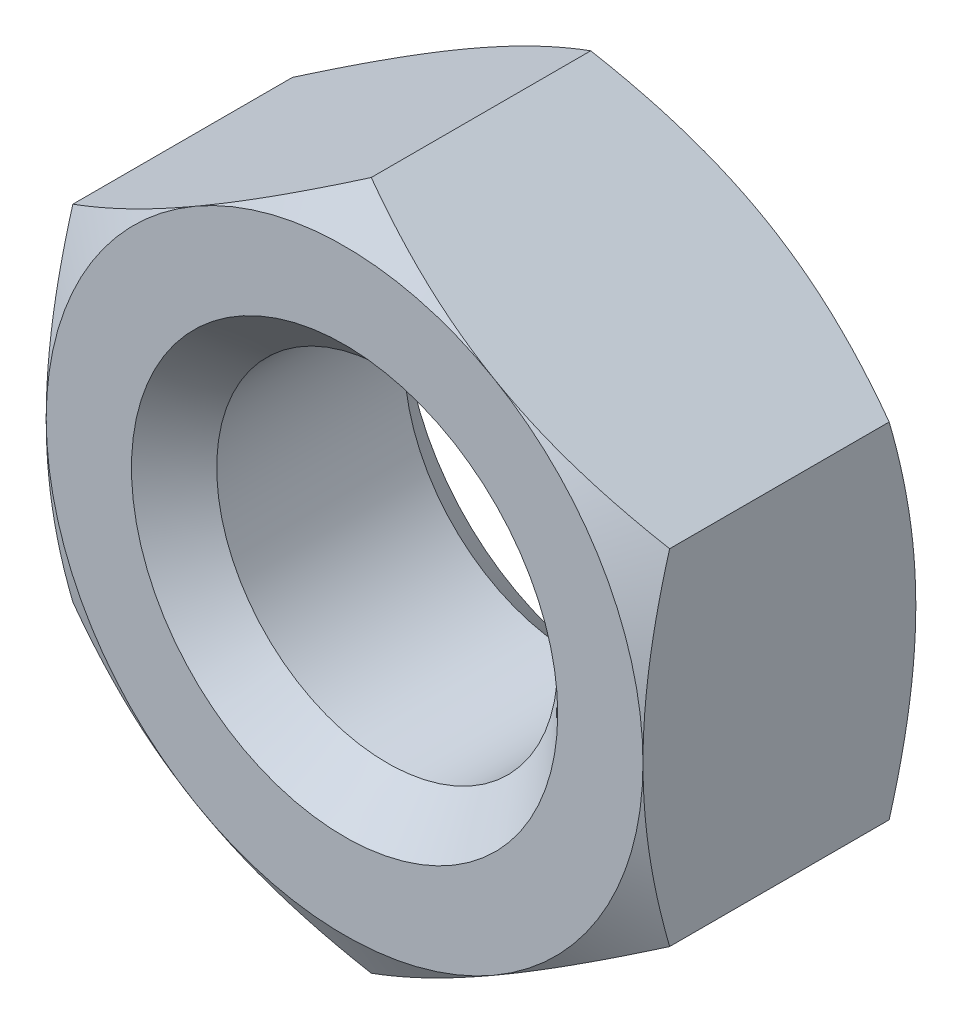
ISO-10303-21;
HEADER;
FILE_DESCRIPTION(('STEP AP214'),'2;1');
FILE_NAME('part.step','',(''),(''),'','','');
FILE_SCHEMA(('AUTOMOTIVE_DESIGN { 1 0 10303 214 1 1 1 1 }'));
ENDSEC;
DATA;
#1=APPLICATION_CONTEXT('core data for automotive mechanical design processes');
#2=APPLICATION_PROTOCOL_DEFINITION('international standard','automotive_design',2000,#1);
#3=PRODUCT_CONTEXT('',#1,'mechanical');
#4=PRODUCT('Part','Part','',(#3));
#5=PRODUCT_RELATED_PRODUCT_CATEGORY('part','',(#4));
#6=PRODUCT_DEFINITION_FORMATION('','',#4);
#7=PRODUCT_DEFINITION_CONTEXT('part definition',#1,'design');
#8=PRODUCT_DEFINITION('design','',#6,#7);
#9=PRODUCT_DEFINITION_SHAPE('','',#8);
#10=(LENGTH_UNIT() NAMED_UNIT(*) SI_UNIT(.MILLI.,.METRE.));
#11=(NAMED_UNIT(*) PLANE_ANGLE_UNIT() SI_UNIT($,.RADIAN.));
#12=(NAMED_UNIT(*) SI_UNIT($,.STERADIAN.) SOLID_ANGLE_UNIT());
#13=UNCERTAINTY_MEASURE_WITH_UNIT(LENGTH_MEASURE(1.E-05),#10,'distance_accuracy_value','');
#14=(GEOMETRIC_REPRESENTATION_CONTEXT(3) GLOBAL_UNCERTAINTY_ASSIGNED_CONTEXT((#13)) GLOBAL_UNIT_ASSIGNED_CONTEXT((#10,
#11,#12)) REPRESENTATION_CONTEXT('',''));
#15=CARTESIAN_POINT('',(0.,0.,0.));
#16=DIRECTION('',(0.,0.,1.));
#17=DIRECTION('',(1.,0.,0.));
#18=AXIS2_PLACEMENT_3D('',#15,#16,#17);
#19=CARTESIAN_POINT('',(3.5,2.02072594216369,1.6));
#20=DIRECTION('',(-0.5,-0.866025403784439,0.));
#21=DIRECTION('',(0.866025403784439,-0.5,0.));
#22=AXIS2_PLACEMENT_3D('',#19,#20,#21);
#23=PLANE('',#22);
#24=CARTESIAN_POINT('',(-0.000200000000000759,4.04156735438122,-1.28732593930663));
#25=CARTESIAN_POINT('',(0.153607178452449,3.9527667384984,-1.33861421101002));
#26=CARTESIAN_POINT('',(0.308742010834423,3.86319960126198,-1.38525904618381));
#27=CARTESIAN_POINT('',(0.62169800657678,3.68251437287562,-1.46667812446665));
#28=CARTESIAN_POINT('',(0.779524730787495,3.59139307116725,-1.50142356441544));
#29=CARTESIAN_POINT('',(1.09322221038013,3.41027974688034,-1.55550997281716));
#30=CARTESIAN_POINT('',(1.24904469916069,3.32031559103708,-1.57521091373962));
#31=CARTESIAN_POINT('',(1.56142288720537,3.13996396008052,-1.59872986726275));
#32=CARTESIAN_POINT('',(1.71797745103423,3.04957714051106,-1.60256735545444));
#33=CARTESIAN_POINT('',(2.01050921992099,2.88068384499777,-1.59458469812302));
#34=CARTESIAN_POINT('',(2.1465302124579,2.80215208834115,-1.58472456593039));
#35=CARTESIAN_POINT('',(2.41768602028899,2.64560020969754,-1.5534735331006));
#36=CARTESIAN_POINT('',(2.55281989768468,2.5675806292065,-1.5320719567142));
#37=CARTESIAN_POINT('',(2.82453479240518,2.41070596159679,-1.47856959211943));
#38=CARTESIAN_POINT('',(2.96108141927833,2.33187072981464,-1.44624200555492));
#39=CARTESIAN_POINT('',(3.2321380929445,2.17537608630783,-1.37287106619201));
#40=CARTESIAN_POINT('',(3.36665161246853,2.09771466960098,-1.33184495343014));
#41=CARTESIAN_POINT('',(3.5002,2.02061047210985,-1.28732593930663));
#42=B_SPLINE_CURVE_WITH_KNOTS('',3,(#24,#25,#26,#27,#28,#29,#30,#31,#32,#33,#34,#35,#36,#37,#38,
#39,#40,#41),.UNSPECIFIED.,.F.,.F.,(4,2,2,2,2,2,2,2,4),(0.,0.554793832886253,1.11092123814983,
1.65328467083218,2.19498204478403,2.6666513085086,3.13875761298267,3.62133612600509,
4.10296698719187),.UNSPECIFIED.);
#43=CARTESIAN_POINT('',(0.,4.04145188432738,-1.28739260883036));
#44=VERTEX_POINT('',#43);
#45=CARTESIAN_POINT('',(1.75,3.03108891324554,-1.6));
#46=VERTEX_POINT('',#45);
#47=EDGE_CURVE('E33',#44,#46,#42,.T.);
#48=ORIENTED_EDGE('',*,*,#47,.F.);
#49=DIRECTION('',(0.,0.,-1.));
#50=VECTOR('',#49,1.);
#51=CARTESIAN_POINT('',(0.,4.04145188432738,1.6));
#52=LINE('',#51,#50);
#53=CARTESIAN_POINT('',(0.,4.04145188432738,1.28739260883036));
#54=VERTEX_POINT('',#53);
#55=EDGE_CURVE('E149',#54,#44,#52,.T.);
#56=ORIENTED_EDGE('',*,*,#55,.F.);
#57=CARTESIAN_POINT('',(3.5002,2.02061047210985,1.28732593930663));
#58=CARTESIAN_POINT('',(3.34639282154755,2.10941108799267,1.33861421101002));
#59=CARTESIAN_POINT('',(3.19125798916558,2.19897822522909,1.38525904618381));
#60=CARTESIAN_POINT('',(2.87830199342322,2.37966345361545,1.46667812446665));
#61=CARTESIAN_POINT('',(2.7204752692125,2.47078475532382,1.50142356441544));
#62=CARTESIAN_POINT('',(2.40677778961987,2.65189807961073,1.55550997281717));
#63=CARTESIAN_POINT('',(2.25095530083931,2.74186223545399,1.57521091373962));
#64=CARTESIAN_POINT('',(1.93857711279463,2.92221386641055,1.59872986726275));
#65=CARTESIAN_POINT('',(1.78202254896577,3.01260068598001,1.60256735545444));
#66=CARTESIAN_POINT('',(1.48949078007901,3.1814939814933,1.59458469812302));
#67=CARTESIAN_POINT('',(1.35346978754209,3.26002573814993,1.58472456593039));
#68=CARTESIAN_POINT('',(1.08231397971101,3.41657761679354,1.5534735331006));
#69=CARTESIAN_POINT('',(0.947180102315318,3.49459719728457,1.5320719567142));
#70=CARTESIAN_POINT('',(0.675465207594817,3.65147186489429,1.47856959211943));
#71=CARTESIAN_POINT('',(0.538918580721665,3.73030709667644,1.44624200555492));
#72=CARTESIAN_POINT('',(0.267861907055498,3.88680174018324,1.37287106619201));
#73=CARTESIAN_POINT('',(0.133348387531463,3.96446315689009,1.33184495343014));
#74=CARTESIAN_POINT('',(-0.000200000000000305,4.04156735438122,1.28732593930663));
#75=B_SPLINE_CURVE_WITH_KNOTS('',3,(#57,#58,#59,#60,#61,#62,#63,#64,#65,#66,#67,#68,#69,#70,#71,
#72,#73,#74),.UNSPECIFIED.,.F.,.F.,(4,2,2,2,2,2,2,2,4),(0.,0.554793832886253,1.11092123814983,
1.65328467083218,2.19498204478403,2.6666513085086,3.13875761298267,3.62133612600509,
4.10296698719187),.UNSPECIFIED.);
#76=CARTESIAN_POINT('',(1.75,3.03108891324554,1.6));
#77=VERTEX_POINT('',#76);
#78=EDGE_CURVE('E211',#77,#54,#75,.T.);
#79=ORIENTED_EDGE('',*,*,#78,.F.);
#80=CARTESIAN_POINT('',(3.5,2.02072594216369,1.28739260883036));
#81=VERTEX_POINT('',#80);
#82=EDGE_CURVE('E138',#81,#77,#75,.T.);
#83=ORIENTED_EDGE('',*,*,#82,.F.);
#84=DIRECTION('',(0.,0.,-1.));
#85=VECTOR('',#84,1.);
#86=CARTESIAN_POINT('',(3.5,2.02072594216369,1.6));
#87=LINE('',#86,#85);
#88=CARTESIAN_POINT('',(3.5,2.02072594216369,-1.28739260883036));
#89=VERTEX_POINT('',#88);
#90=EDGE_CURVE('E134',#81,#89,#87,.T.);
#91=ORIENTED_EDGE('',*,*,#90,.T.);
#92=EDGE_CURVE('E128',#46,#89,#42,.T.);
#93=ORIENTED_EDGE('',*,*,#92,.F.);
#94=EDGE_LOOP('',(#48,#56,#79,#83,#91,#93));
#95=FACE_BOUND('',#94,.T.);
#96=ADVANCED_FACE('F16',(#95),#23,.F.);
#97=CARTESIAN_POINT('',(0.,4.04145188432738,1.6));
#98=DIRECTION('',(0.5,-0.866025403784438,0.));
#99=DIRECTION('',(0.866025403784439,0.5,0.));
#100=AXIS2_PLACEMENT_3D('',#97,#98,#99);
#101=PLANE('',#100);
#102=CARTESIAN_POINT('',(-3.5002,2.02061047210985,-1.28732593930663));
#103=CARTESIAN_POINT('',(-3.34639282154755,2.10941108799267,-1.33861421101002));
#104=CARTESIAN_POINT('',(-3.19125798916558,2.19897822522909,-1.38525904618381));
#105=CARTESIAN_POINT('',(-2.87830199342322,2.37966345361545,-1.46667812446665));
#106=CARTESIAN_POINT('',(-2.7204752692125,2.47078475532382,-1.50142356441544));
#107=CARTESIAN_POINT('',(-2.40677778961987,2.65189807961073,-1.55550997281716));
#108=CARTESIAN_POINT('',(-2.25095530083931,2.74186223545399,-1.57521091373962));
#109=CARTESIAN_POINT('',(-1.93857711279463,2.92221386641056,-1.59872986726275));
#110=CARTESIAN_POINT('',(-1.78202254896577,3.01260068598001,-1.60256735545443));
#111=CARTESIAN_POINT('',(-1.48949078007901,3.1814939814933,-1.59458469812302));
#112=CARTESIAN_POINT('',(-1.3534697875421,3.26002573814993,-1.58472456593039));
#113=CARTESIAN_POINT('',(-1.08231397971101,3.41657761679354,-1.5534735331006));
#114=CARTESIAN_POINT('',(-0.947180102315319,3.49459719728457,-1.5320719567142));
#115=CARTESIAN_POINT('',(-0.675465207594818,3.65147186489429,-1.47856959211942));
#116=CARTESIAN_POINT('',(-0.538918580721666,3.73030709667644,-1.44624200555492));
#117=CARTESIAN_POINT('',(-0.267861907055499,3.88680174018324,-1.37287106619201));
#118=CARTESIAN_POINT('',(-0.133348387531464,3.96446315689009,-1.33184495343014));
#119=CARTESIAN_POINT('',(0.000199999999999133,4.04156735438122,-1.28732593930663));
#120=B_SPLINE_CURVE_WITH_KNOTS('',3,(#102,#103,#104,#105,#106,#107,#108,#109,#110,#111,#112,
#113,#114,#115,#116,#117,#118,#119),.UNSPECIFIED.,.F.,.F.,(4,2,2,2,2,2,2,2,4),(0.,
0.554793832886253,1.11092123814984,1.65328467083218,2.19498204478403,2.6666513085086,
3.13875761298267,3.62133612600509,4.10296698719187),.UNSPECIFIED.);
#121=CARTESIAN_POINT('',(-3.5,2.02072594216369,-1.28739260883036));
#122=VERTEX_POINT('',#121);
#123=CARTESIAN_POINT('',(-1.75,3.03108891324554,-1.6));
#124=VERTEX_POINT('',#123);
#125=EDGE_CURVE('E39',#122,#124,#120,.T.);
#126=ORIENTED_EDGE('',*,*,#125,.F.);
#127=DIRECTION('',(0.,0.,-1.));
#128=VECTOR('',#127,1.);
#129=CARTESIAN_POINT('',(-3.5,2.02072594216369,1.6));
#130=LINE('',#129,#128);
#131=CARTESIAN_POINT('',(-3.5,2.02072594216369,1.28739260883036));
#132=VERTEX_POINT('',#131);
#133=EDGE_CURVE('E148',#132,#122,#130,.T.);
#134=ORIENTED_EDGE('',*,*,#133,.F.);
#135=CARTESIAN_POINT('',(0.000199999999999189,4.04156735438122,1.28732593930663));
#136=CARTESIAN_POINT('',(-0.15360717845245,3.9527667384984,1.33861421101002));
#137=CARTESIAN_POINT('',(-0.308742010834424,3.86319960126198,1.38525904618381));
#138=CARTESIAN_POINT('',(-0.621698006576781,3.68251437287562,1.46667812446665));
#139=CARTESIAN_POINT('',(-0.779524730787496,3.59139307116725,1.50142356441544));
#140=CARTESIAN_POINT('',(-1.09322221038013,3.41027974688034,1.55550997281716));
#141=CARTESIAN_POINT('',(-1.24904469916069,3.32031559103708,1.57521091373962));
#142=CARTESIAN_POINT('',(-1.56142288720537,3.13996396008052,1.59872986726275));
#143=CARTESIAN_POINT('',(-1.71797745103423,3.04957714051106,1.60256735545443));
#144=CARTESIAN_POINT('',(-2.01050921992099,2.88068384499777,1.59458469812302));
#145=CARTESIAN_POINT('',(-2.1465302124579,2.80215208834114,1.58472456593039));
#146=CARTESIAN_POINT('',(-2.41768602028899,2.64560020969754,1.5534735331006));
#147=CARTESIAN_POINT('',(-2.55281989768468,2.5675806292065,1.5320719567142));
#148=CARTESIAN_POINT('',(-2.82453479240518,2.41070596159678,1.47856959211943));
#149=CARTESIAN_POINT('',(-2.96108141927833,2.33187072981464,1.44624200555492));
#150=CARTESIAN_POINT('',(-3.2321380929445,2.17537608630783,1.37287106619201));
#151=CARTESIAN_POINT('',(-3.36665161246854,2.09771466960098,1.33184495343014));
#152=CARTESIAN_POINT('',(-3.5002,2.02061047210985,1.28732593930663));
#153=B_SPLINE_CURVE_WITH_KNOTS('',3,(#135,#136,#137,#138,#139,#140,#141,#142,#143,#144,#145,
#146,#147,#148,#149,#150,#151,#152),.UNSPECIFIED.,.F.,.F.,(4,2,2,2,2,2,2,2,4),(0.,
0.554793832886252,1.11092123814983,1.65328467083218,2.19498204478403,2.6666513085086,
3.13875761298267,3.62133612600509,4.10296698719187),.UNSPECIFIED.);
#154=CARTESIAN_POINT('',(-1.75,3.03108891324554,1.6));
#155=VERTEX_POINT('',#154);
#156=EDGE_CURVE('E201',#155,#132,#153,.T.);
#157=ORIENTED_EDGE('',*,*,#156,.F.);
#158=EDGE_CURVE('E207',#54,#155,#153,.T.);
#159=ORIENTED_EDGE('',*,*,#158,.F.);
#160=ORIENTED_EDGE('',*,*,#55,.T.);
#161=EDGE_CURVE('E226',#124,#44,#120,.T.);
#162=ORIENTED_EDGE('',*,*,#161,.F.);
#163=EDGE_LOOP('',(#126,#134,#157,#159,#160,#162));
#164=FACE_BOUND('',#163,.T.);
#165=ADVANCED_FACE('F220',(#164),#101,.F.);
#166=CARTESIAN_POINT('',(-3.5,2.02072594216369,1.6));
#167=DIRECTION('',(1.,0.,0.));
#168=DIRECTION('',(0.,1.,0.));
#169=AXIS2_PLACEMENT_3D('',#166,#167,#168);
#170=PLANE('',#169);
#171=CARTESIAN_POINT('',(-3.5,-5.41621162695777,0.102415580260261));
#172=CARTESIAN_POINT('',(-3.5,-5.26344419018355,0.0283568197832177));
#173=CARTESIAN_POINT('',(-3.5,-5.11032480928123,-0.0449884509574243));
#174=CARTESIAN_POINT('',(-3.5,-4.80319495994508,-0.189850505327373));
#175=CARTESIAN_POINT('',(-3.5,-4.64918435465378,-0.261366998470575));
#176=CARTESIAN_POINT('',(-3.5,-4.33928569174284,-0.402532307521457));
#177=CARTESIAN_POINT('',(-3.5,-4.18339197007812,-0.472168732381122));
#178=CARTESIAN_POINT('',(-3.5,-3.87036052673769,-0.608576231476142));
#179=CARTESIAN_POINT('',(-3.5,-3.71322286459895,-0.675347441874813));
#180=CARTESIAN_POINT('',(-3.5,-3.39242099458055,-0.807338321562648));
#181=CARTESIAN_POINT('',(-3.5,-3.22870832023637,-0.872440839987188));
#182=CARTESIAN_POINT('',(-3.5,-2.8993632650183,-0.997690246119828));
#183=CARTESIAN_POINT('',(-3.5,-2.73373067043321,-1.05783657598075));
#184=CARTESIAN_POINT('',(-3.5,-2.40059616492489,-1.17158604614316));
#185=CARTESIAN_POINT('',(-3.5,-2.23309885839724,-1.22520253513884));
#186=CARTESIAN_POINT('',(-3.5,-1.89570159450217,-1.32416405693447));
#187=CARTESIAN_POINT('',(-3.5,-1.7258024159599,-1.36951170755781));
#188=CARTESIAN_POINT('',(-3.5,-1.38444915293116,-1.44951008595251));
#189=CARTESIAN_POINT('',(-3.5,-1.21300885822572,-1.48421856751867));
#190=CARTESIAN_POINT('',(-3.5,-0.86800843897435,-1.54096984587649));
#191=CARTESIAN_POINT('',(-3.5,-0.694448512334105,-1.56301381603299));
#192=CARTESIAN_POINT('',(-3.5,-0.348337616682576,-1.59238875514107));
#193=CARTESIAN_POINT('',(-3.5,-0.17580302228776,-1.59990790964916));
#194=CARTESIAN_POINT('',(-3.5,0.1692875729825,-1.60009033966741));
#195=CARTESIAN_POINT('',(-3.5,0.341843574218332,-1.5927533167532));
#196=CARTESIAN_POINT('',(-3.5,0.635144611727219,-1.5681732020756));
#197=CARTESIAN_POINT('',(-3.5,0.756204679923099,-1.55447734790396));
#198=CARTESIAN_POINT('',(-3.5,0.99742558785691,-1.52063245099531));
#199=CARTESIAN_POINT('',(-3.5,1.11758630157485,-1.50048252060014));
#200=CARTESIAN_POINT('',(-3.5,1.47656716154707,-1.43141206253294));
#201=CARTESIAN_POINT('',(-3.5,1.71374889025022,-1.37388387477646));
#202=CARTESIAN_POINT('',(-3.5,2.06837451941409,-1.27429701764847));
#203=CARTESIAN_POINT('',(-3.5,2.18766109557644,-1.23842776696909));
#204=CARTESIAN_POINT('',(-3.5,2.42507517810837,-1.16300566248803));
#205=CARTESIAN_POINT('',(-3.5,2.5432026769522,-1.12345278478652));
#206=CARTESIAN_POINT('',(-3.5,2.77833679549326,-1.04129471095997));
#207=CARTESIAN_POINT('',(-3.5,2.89534378038023,-0.998690550528373));
#208=CARTESIAN_POINT('',(-3.5,3.12839114789541,-0.910926675019034));
#209=CARTESIAN_POINT('',(-3.5,3.24443154074151,-0.865766986995336));
#210=CARTESIAN_POINT('',(-3.5,3.51365775634845,-0.758122894001806));
#211=CARTESIAN_POINT('',(-3.5,3.66651682351437,-0.69482276630203));
#212=CARTESIAN_POINT('',(-3.5,3.97096714322062,-0.565236823414831));
#213=CARTESIAN_POINT('',(-3.5,4.12255832523463,-0.498950843431371));
#214=CARTESIAN_POINT('',(-3.5,4.57579860853191,-0.296520083992373));
#215=CARTESIAN_POINT('',(-3.5,4.8758600288297,-0.156824772939951));
#216=CARTESIAN_POINT('',(-3.5,5.47327893165281,0.128894395497239));
#217=CARTESIAN_POINT('',(-3.5,5.77063351660495,0.274924246166546));
#218=CARTESIAN_POINT('',(-3.5,6.36320680824287,0.571270437477896));
#219=CARTESIAN_POINT('',(-3.5,6.65842543853529,0.721586930492738));
#220=CARTESIAN_POINT('',(-3.5,7.22331568790981,1.0129032980222));
#221=CARTESIAN_POINT('',(-3.5,7.49311038795026,1.15366532609239));
#222=CARTESIAN_POINT('',(-3.5,8.03168770400089,1.43713169807634));
#223=CARTESIAN_POINT('',(-3.5,8.30047028641226,1.57983610575725));
#224=CARTESIAN_POINT('',(-3.5,8.83660156798503,1.86638765098259));
#225=CARTESIAN_POINT('',(-3.5,9.10395215761347,2.01023125674271));
#226=CARTESIAN_POINT('',(-3.5,9.63800319450943,2.29908725744369));
#227=CARTESIAN_POINT('',(-3.5,9.90470367541192,2.44409959017098));
#228=CARTESIAN_POINT('',(-3.5,10.1711635536292,2.58954962967889));
#229=B_SPLINE_CURVE_WITH_KNOTS('',3,(#171,#172,#173,#174,#175,#176,#177,#178,#179,#180,#181,
#182,#183,#184,#185,#186,#187,#188,#189,#190,#191,#192,#193,#194,#195,#196,#197,#198,#199,#200,
#201,#202,#203,#204,#205,#206,#207,#208,#209,#210,#211,#212,#213,#214,#215,#216,#217,#218,#219,
#220,#221,#222,#223,#224,#225,#226,#227,#228),.UNSPECIFIED.,.F.,.F.,(4,2,2,2,2,2,2,2,2,2,2,2,2,
2,2,2,2,2,2,2,2,2,2,2,2,2,2,2,4),(0.,0.509322791139774,1.01872598765631,1.5309223480716,
2.04309434040917,2.57157901618229,3.10012309488775,3.62756787943293,4.15484538972848,
4.67920774925864,5.20352151886718,5.72099540311569,6.23847968225559,6.6037991862398,
6.9691689558503,7.70031987930098,8.07397715968174,8.44763686456668,8.82117033422627,
9.19469985022071,9.69099922370867,10.1873260227406,11.1801559462459,12.1739466258584,
13.1677726748505,14.0806863260515,14.9936300202874,15.9043990286425,16.8151198710928),.UNSPECIFIED.);
#230=CARTESIAN_POINT('',(-3.5,-2.02072594216369,-1.28739260883036));
#231=VERTEX_POINT('',#230);
#232=CARTESIAN_POINT('',(-3.5,0.,-1.6));
#233=VERTEX_POINT('',#232);
#234=EDGE_CURVE('E243',#231,#233,#229,.T.);
#235=ORIENTED_EDGE('',*,*,#234,.F.);
#236=DIRECTION('',(0.,0.,-1.));
#237=VECTOR('',#236,1.);
#238=CARTESIAN_POINT('',(-3.5,-2.02072594216369,1.6));
#239=LINE('',#238,#237);
#240=CARTESIAN_POINT('',(-3.5,-2.02072594216369,1.28739260883036));
#241=VERTEX_POINT('',#240);
#242=EDGE_CURVE('E140',#241,#231,#239,.T.);
#243=ORIENTED_EDGE('',*,*,#242,.F.);
#244=CARTESIAN_POINT('',(-3.5,-5.41621162695777,-0.102415580260261));
#245=CARTESIAN_POINT('',(-3.5,-5.26344419018355,-0.0283568197832177));
#246=CARTESIAN_POINT('',(-3.5,-5.11032480928123,0.0449884509574243));
#247=CARTESIAN_POINT('',(-3.5,-4.80319495994508,0.189850505327373));
#248=CARTESIAN_POINT('',(-3.5,-4.64918435465378,0.261366998470575));
#249=CARTESIAN_POINT('',(-3.5,-4.33928569174284,0.402532307521457));
#250=CARTESIAN_POINT('',(-3.5,-4.18339197007812,0.472168732381122));
#251=CARTESIAN_POINT('',(-3.5,-3.87036052673769,0.608576231476142));
#252=CARTESIAN_POINT('',(-3.5,-3.71322286459895,0.675347441874813));
#253=CARTESIAN_POINT('',(-3.5,-3.39242099458055,0.807338321562648));
#254=CARTESIAN_POINT('',(-3.5,-3.22870832023637,0.872440839987188));
#255=CARTESIAN_POINT('',(-3.5,-2.8993632650183,0.997690246119828));
#256=CARTESIAN_POINT('',(-3.5,-2.73373067043321,1.05783657598075));
#257=CARTESIAN_POINT('',(-3.5,-2.40059616492489,1.17158604614316));
#258=CARTESIAN_POINT('',(-3.5,-2.23309885839724,1.22520253513884));
#259=CARTESIAN_POINT('',(-3.5,-1.89570159450217,1.32416405693447));
#260=CARTESIAN_POINT('',(-3.5,-1.7258024159599,1.36951170755781));
#261=CARTESIAN_POINT('',(-3.5,-1.38444915293116,1.44951008595251));
#262=CARTESIAN_POINT('',(-3.5,-1.21300885822572,1.48421856751867));
#263=CARTESIAN_POINT('',(-3.5,-0.86800843897435,1.54096984587649));
#264=CARTESIAN_POINT('',(-3.5,-0.694448512334105,1.56301381603299));
#265=CARTESIAN_POINT('',(-3.5,-0.348337616682576,1.59238875514107));
#266=CARTESIAN_POINT('',(-3.5,-0.17580302228776,1.59990790964916));
#267=CARTESIAN_POINT('',(-3.5,0.1692875729825,1.60009033966741));
#268=CARTESIAN_POINT('',(-3.5,0.341843574218332,1.5927533167532));
#269=CARTESIAN_POINT('',(-3.5,0.635144611727219,1.5681732020756));
#270=CARTESIAN_POINT('',(-3.5,0.756204679923099,1.55447734790396));
#271=CARTESIAN_POINT('',(-3.5,0.99742558785691,1.52063245099531));
#272=CARTESIAN_POINT('',(-3.5,1.11758630157485,1.50048252060014));
#273=CARTESIAN_POINT('',(-3.5,1.47656716154707,1.43141206253294));
#274=CARTESIAN_POINT('',(-3.5,1.71374889025022,1.37388387477646));
#275=CARTESIAN_POINT('',(-3.5,2.06837451941409,1.27429701764847));
#276=CARTESIAN_POINT('',(-3.5,2.18766109557644,1.23842776696909));
#277=CARTESIAN_POINT('',(-3.5,2.42507517810837,1.16300566248803));
#278=CARTESIAN_POINT('',(-3.5,2.5432026769522,1.12345278478652));
#279=CARTESIAN_POINT('',(-3.5,2.77833679549326,1.04129471095997));
#280=CARTESIAN_POINT('',(-3.5,2.89534378038023,0.998690550528373));
#281=CARTESIAN_POINT('',(-3.5,3.12839114789541,0.910926675019034));
#282=CARTESIAN_POINT('',(-3.5,3.24443154074151,0.865766986995336));
#283=CARTESIAN_POINT('',(-3.5,3.51365775634845,0.758122894001806));
#284=CARTESIAN_POINT('',(-3.5,3.66651682351437,0.69482276630203));
#285=CARTESIAN_POINT('',(-3.5,3.97096714322062,0.565236823414831));
#286=CARTESIAN_POINT('',(-3.5,4.12255832523463,0.498950843431371));
#287=CARTESIAN_POINT('',(-3.5,4.57579860853191,0.296520083992373));
#288=CARTESIAN_POINT('',(-3.5,4.8758600288297,0.156824772939951));
#289=CARTESIAN_POINT('',(-3.5,5.47327893165281,-0.128894395497239));
#290=CARTESIAN_POINT('',(-3.5,5.77063351660495,-0.274924246166546));
#291=CARTESIAN_POINT('',(-3.5,6.36320680824287,-0.571270437477896));
#292=CARTESIAN_POINT('',(-3.5,6.65842543853529,-0.721586930492738));
#293=CARTESIAN_POINT('',(-3.5,7.22331568790981,-1.0129032980222));
#294=CARTESIAN_POINT('',(-3.5,7.49311038795026,-1.15366532609239));
#295=CARTESIAN_POINT('',(-3.5,8.03168770400089,-1.43713169807634));
#296=CARTESIAN_POINT('',(-3.5,8.30047028641226,-1.57983610575725));
#297=CARTESIAN_POINT('',(-3.5,8.83660156798503,-1.86638765098259));
#298=CARTESIAN_POINT('',(-3.5,9.10395215761347,-2.01023125674271));
#299=CARTESIAN_POINT('',(-3.5,9.63800319450943,-2.29908725744369));
#300=CARTESIAN_POINT('',(-3.5,9.90470367541192,-2.44409959017098));
#301=CARTESIAN_POINT('',(-3.5,10.1711635536292,-2.58954962967889));
#302=B_SPLINE_CURVE_WITH_KNOTS('',3,(#244,#245,#246,#247,#248,#249,#250,#251,#252,#253,#254,
#255,#256,#257,#258,#259,#260,#261,#262,#263,#264,#265,#266,#267,#268,#269,#270,#271,#272,#273,
#274,#275,#276,#277,#278,#279,#280,#281,#282,#283,#284,#285,#286,#287,#288,#289,#290,#291,#292,
#293,#294,#295,#296,#297,#298,#299,#300,#301),.UNSPECIFIED.,.F.,.F.,(4,2,2,2,2,2,2,2,2,2,2,2,2,
2,2,2,2,2,2,2,2,2,2,2,2,2,2,2,4),(0.,0.509322791139774,1.01872598765631,1.5309223480716,
2.04309434040917,2.57157901618229,3.10012309488775,3.62756787943293,4.15484538972848,
4.67920774925864,5.20352151886718,5.72099540311569,6.23847968225559,6.6037991862398,
6.9691689558503,7.70031987930098,8.07397715968174,8.44763686456668,8.82117033422627,
9.19469985022071,9.69099922370867,10.1873260227406,11.1801559462459,12.1739466258584,
13.1677726748505,14.0806863260515,14.9936300202874,15.9043990286425,16.8151198710928),.UNSPECIFIED.);
#303=CARTESIAN_POINT('',(-3.5,0.,1.6));
#304=VERTEX_POINT('',#303);
#305=EDGE_CURVE('E198',#304,#241,#302,.F.);
#306=ORIENTED_EDGE('',*,*,#305,.F.);
#307=EDGE_CURVE('E209',#132,#304,#302,.F.);
#308=ORIENTED_EDGE('',*,*,#307,.F.);
#309=ORIENTED_EDGE('',*,*,#133,.T.);
#310=EDGE_CURVE('E237',#233,#122,#229,.T.);
#311=ORIENTED_EDGE('',*,*,#310,.F.);
#312=EDGE_LOOP('',(#235,#243,#306,#308,#309,#311));
#313=FACE_BOUND('',#312,.T.);
#314=ADVANCED_FACE('F219',(#313),#170,.F.);
#315=CARTESIAN_POINT('',(-3.5,-2.02072594216369,1.6));
#316=DIRECTION('',(0.5,0.866025403784439,0.));
#317=DIRECTION('',(-0.866025403784439,0.5,0.));
#318=AXIS2_PLACEMENT_3D('',#315,#316,#317);
#319=PLANE('',#318);
#320=CARTESIAN_POINT('',(0.000200000000000424,-4.04156735438122,-1.28732593930663));
#321=CARTESIAN_POINT('',(-0.153607178452449,-3.9527667384984,-1.33861421101002));
#322=CARTESIAN_POINT('',(-0.308742010834423,-3.86319960126198,-1.38525904618381));
#323=CARTESIAN_POINT('',(-0.62169800657678,-3.68251437287562,-1.46667812446665));
#324=CARTESIAN_POINT('',(-0.779524730787495,-3.59139307116725,-1.50142356441544));
#325=CARTESIAN_POINT('',(-1.09322221038013,-3.41027974688034,-1.55550997281716));
#326=CARTESIAN_POINT('',(-1.24904469916069,-3.32031559103708,-1.57521091373962));
#327=CARTESIAN_POINT('',(-1.56142288720537,-3.13996396008052,-1.59872986726275));
#328=CARTESIAN_POINT('',(-1.71797745103423,-3.04957714051106,-1.60256735545444));
#329=CARTESIAN_POINT('',(-2.01050921992099,-2.88068384499777,-1.59458469812302));
#330=CARTESIAN_POINT('',(-2.1465302124579,-2.80215208834114,-1.58472456593039));
#331=CARTESIAN_POINT('',(-2.41768602028899,-2.64560020969754,-1.5534735331006));
#332=CARTESIAN_POINT('',(-2.55281989768468,-2.5675806292065,-1.5320719567142));
#333=CARTESIAN_POINT('',(-2.82453479240518,-2.41070596159678,-1.47856959211943));
#334=CARTESIAN_POINT('',(-2.96108141927833,-2.33187072981464,-1.44624200555492));
#335=CARTESIAN_POINT('',(-3.2321380929445,-2.17537608630783,-1.37287106619201));
#336=CARTESIAN_POINT('',(-3.36665161246853,-2.09771466960098,-1.33184495343014));
#337=CARTESIAN_POINT('',(-3.5002,-2.02061047210985,-1.28732593930663));
#338=B_SPLINE_CURVE_WITH_KNOTS('',3,(#320,#321,#322,#323,#324,#325,#326,#327,#328,#329,#330,
#331,#332,#333,#334,#335,#336,#337),.UNSPECIFIED.,.F.,.F.,(4,2,2,2,2,2,2,2,4),(0.,
0.554793832886253,1.11092123814983,1.65328467083218,2.19498204478403,2.6666513085086,
3.13875761298267,3.62133612600509,4.10296698719187),.UNSPECIFIED.);
#339=CARTESIAN_POINT('',(0.,-4.04145188432738,-1.28739260883036));
#340=VERTEX_POINT('',#339);
#341=CARTESIAN_POINT('',(-1.75,-3.03108891324554,-1.6));
#342=VERTEX_POINT('',#341);
#343=EDGE_CURVE('E235',#340,#342,#338,.T.);
#344=ORIENTED_EDGE('',*,*,#343,.F.);
#345=DIRECTION('',(0.,0.,-1.));
#346=VECTOR('',#345,1.);
#347=CARTESIAN_POINT('',(0.,-4.04145188432738,1.6));
#348=LINE('',#347,#346);
#349=CARTESIAN_POINT('',(0.,-4.04145188432738,1.28739260883036));
#350=VERTEX_POINT('',#349);
#351=EDGE_CURVE('E133',#350,#340,#348,.T.);
#352=ORIENTED_EDGE('',*,*,#351,.F.);
#353=CARTESIAN_POINT('',(-3.5002,-2.02061047210985,1.28732593930663));
#354=CARTESIAN_POINT('',(-3.34639282154755,-2.10941108799267,1.33861421101002));
#355=CARTESIAN_POINT('',(-3.19125798916558,-2.19897822522909,1.38525904618381));
#356=CARTESIAN_POINT('',(-2.87830199342322,-2.37966345361545,1.46667812446665));
#357=CARTESIAN_POINT('',(-2.7204752692125,-2.47078475532382,1.50142356441544));
#358=CARTESIAN_POINT('',(-2.40677778961987,-2.65189807961073,1.55550997281717));
#359=CARTESIAN_POINT('',(-2.25095530083931,-2.74186223545399,1.57521091373962));
#360=CARTESIAN_POINT('',(-1.93857711279463,-2.92221386641055,1.59872986726275));
#361=CARTESIAN_POINT('',(-1.78202254896577,-3.01260068598001,1.60256735545444));
#362=CARTESIAN_POINT('',(-1.48949078007901,-3.1814939814933,1.59458469812302));
#363=CARTESIAN_POINT('',(-1.35346978754209,-3.26002573814993,1.58472456593039));
#364=CARTESIAN_POINT('',(-1.08231397971101,-3.41657761679354,1.5534735331006));
#365=CARTESIAN_POINT('',(-0.947180102315318,-3.49459719728457,1.5320719567142));
#366=CARTESIAN_POINT('',(-0.675465207594817,-3.65147186489429,1.47856959211942));
#367=CARTESIAN_POINT('',(-0.538918580721665,-3.73030709667644,1.44624200555492));
#368=CARTESIAN_POINT('',(-0.267861907055498,-3.88680174018324,1.37287106619201));
#369=CARTESIAN_POINT('',(-0.133348387531463,-3.96446315689009,1.33184495343014));
#370=CARTESIAN_POINT('',(0.0002000000000001,-4.04156735438122,1.28732593930663));
#371=B_SPLINE_CURVE_WITH_KNOTS('',3,(#353,#354,#355,#356,#357,#358,#359,#360,#361,#362,#363,
#364,#365,#366,#367,#368,#369,#370),.UNSPECIFIED.,.F.,.F.,(4,2,2,2,2,2,2,2,4),(0.,
0.554793832886253,1.11092123814983,1.65328467083218,2.19498204478403,2.6666513085086,
3.13875761298267,3.62133612600509,4.10296698719187),.UNSPECIFIED.);
#372=CARTESIAN_POINT('',(-1.75,-3.03108891324554,1.6));
#373=VERTEX_POINT('',#372);
#374=EDGE_CURVE('E188',#373,#350,#371,.T.);
#375=ORIENTED_EDGE('',*,*,#374,.F.);
#376=EDGE_CURVE('E344',#241,#373,#371,.T.);
#377=ORIENTED_EDGE('',*,*,#376,.F.);
#378=ORIENTED_EDGE('',*,*,#242,.T.);
#379=EDGE_CURVE('E244',#342,#231,#338,.T.);
#380=ORIENTED_EDGE('',*,*,#379,.F.);
#381=EDGE_LOOP('',(#344,#352,#375,#377,#378,#380));
#382=FACE_BOUND('',#381,.T.);
#383=ADVANCED_FACE('F302',(#382),#319,.F.);
#384=CARTESIAN_POINT('',(0.,-4.04145188432738,1.6));
#385=DIRECTION('',(-0.5,0.866025403784439,0.));
#386=DIRECTION('',(-0.866025403784439,-0.5,0.));
#387=AXIS2_PLACEMENT_3D('',#384,#385,#386);
#388=PLANE('',#387);
#389=CARTESIAN_POINT('',(3.5002,-2.02061047210985,-1.28732593930663));
#390=CARTESIAN_POINT('',(3.34639282154755,-2.10941108799267,-1.33861421101002));
#391=CARTESIAN_POINT('',(3.19125798916558,-2.19897822522909,-1.38525904618381));
#392=CARTESIAN_POINT('',(2.87830199342322,-2.37966345361545,-1.46667812446665));
#393=CARTESIAN_POINT('',(2.7204752692125,-2.47078475532382,-1.50142356441544));
#394=CARTESIAN_POINT('',(2.40677778961987,-2.65189807961073,-1.55550997281716));
#395=CARTESIAN_POINT('',(2.25095530083931,-2.74186223545399,-1.57521091373962));
#396=CARTESIAN_POINT('',(1.93857711279463,-2.92221386641056,-1.59872986726275));
#397=CARTESIAN_POINT('',(1.78202254896577,-3.01260068598001,-1.60256735545444));
#398=CARTESIAN_POINT('',(1.48949078007901,-3.1814939814933,-1.59458469812302));
#399=CARTESIAN_POINT('',(1.35346978754209,-3.26002573814993,-1.58472456593039));
#400=CARTESIAN_POINT('',(1.08231397971101,-3.41657761679354,-1.5534735331006));
#401=CARTESIAN_POINT('',(0.947180102315318,-3.49459719728457,-1.5320719567142));
#402=CARTESIAN_POINT('',(0.675465207594817,-3.65147186489429,-1.47856959211942));
#403=CARTESIAN_POINT('',(0.538918580721665,-3.73030709667644,-1.44624200555492));
#404=CARTESIAN_POINT('',(0.267861907055499,-3.88680174018324,-1.37287106619201));
#405=CARTESIAN_POINT('',(0.133348387531464,-3.96446315689009,-1.33184495343014));
#406=CARTESIAN_POINT('',(-0.000199999999999427,-4.04156735438122,-1.28732593930663));
#407=B_SPLINE_CURVE_WITH_KNOTS('',3,(#389,#390,#391,#392,#393,#394,#395,#396,#397,#398,#399,
#400,#401,#402,#403,#404,#405,#406),.UNSPECIFIED.,.F.,.F.,(4,2,2,2,2,2,2,2,4),(0.,
0.554793832886253,1.11092123814983,1.65328467083218,2.19498204478403,2.6666513085086,
3.13875761298267,3.62133612600509,4.10296698719187),.UNSPECIFIED.);
#408=CARTESIAN_POINT('',(3.5,-2.02072594216434,-1.28739260883079));
#409=VERTEX_POINT('',#408);
#410=CARTESIAN_POINT('',(1.75,-3.03108891324554,-1.6));
#411=VERTEX_POINT('',#410);
#412=EDGE_CURVE('E109',#409,#411,#407,.T.);
#413=ORIENTED_EDGE('',*,*,#412,.F.);
#414=DIRECTION('',(0.,0.,-1.));
#415=VECTOR('',#414,1.);
#416=CARTESIAN_POINT('',(3.5,-2.02072594216369,1.6));
#417=LINE('',#416,#415);
#418=CARTESIAN_POINT('',(3.5,-2.02072594216434,1.28739260883079));
#419=VERTEX_POINT('',#418);
#420=EDGE_CURVE('E122',#419,#409,#417,.T.);
#421=ORIENTED_EDGE('',*,*,#420,.F.);
#422=CARTESIAN_POINT('',(-0.000199999999999629,-4.04156735438122,1.28732593930663));
#423=CARTESIAN_POINT('',(0.15360717845245,-3.9527667384984,1.33861421101002));
#424=CARTESIAN_POINT('',(0.308742010834424,-3.86319960126198,1.38525904618381));
#425=CARTESIAN_POINT('',(0.621698006576781,-3.68251437287562,1.46667812446665));
#426=CARTESIAN_POINT('',(0.779524730787496,-3.59139307116725,1.50142356441544));
#427=CARTESIAN_POINT('',(1.09322221038013,-3.41027974688034,1.55550997281716));
#428=CARTESIAN_POINT('',(1.24904469916069,-3.32031559103708,1.57521091373962));
#429=CARTESIAN_POINT('',(1.56142288720537,-3.13996396008052,1.59872986726275));
#430=CARTESIAN_POINT('',(1.71797745103423,-3.04957714051106,1.60256735545444));
#431=CARTESIAN_POINT('',(2.01050921992099,-2.88068384499777,1.59458469812302));
#432=CARTESIAN_POINT('',(2.1465302124579,-2.80215208834114,1.58472456593039));
#433=CARTESIAN_POINT('',(2.41768602028899,-2.64560020969754,1.5534735331006));
#434=CARTESIAN_POINT('',(2.55281989768468,-2.5675806292065,1.5320719567142));
#435=CARTESIAN_POINT('',(2.82453479240518,-2.41070596159679,1.47856959211943));
#436=CARTESIAN_POINT('',(2.96108141927833,-2.33187072981464,1.44624200555492));
#437=CARTESIAN_POINT('',(3.2321380929445,-2.17537608630783,1.37287106619201));
#438=CARTESIAN_POINT('',(3.36665161246853,-2.09771466960099,1.33184495343014));
#439=CARTESIAN_POINT('',(3.5002,-2.02061047210985,1.28732593930663));
#440=B_SPLINE_CURVE_WITH_KNOTS('',3,(#422,#423,#424,#425,#426,#427,#428,#429,#430,#431,#432,
#433,#434,#435,#436,#437,#438,#439),.UNSPECIFIED.,.F.,.F.,(4,2,2,2,2,2,2,2,4),(0.,
0.554793832886253,1.11092123814983,1.65328467083218,2.19498204478403,2.6666513085086,
3.13875761298267,3.62133612600509,4.10296698719187),.UNSPECIFIED.);
#441=CARTESIAN_POINT('',(1.75,-3.03108891324554,1.6));
#442=VERTEX_POINT('',#441);
#443=EDGE_CURVE('E185',#442,#419,#440,.T.);
#444=ORIENTED_EDGE('',*,*,#443,.F.);
#445=EDGE_CURVE('E255',#350,#442,#440,.T.);
#446=ORIENTED_EDGE('',*,*,#445,.F.);
#447=ORIENTED_EDGE('',*,*,#351,.T.);
#448=EDGE_CURVE('E126',#411,#340,#407,.T.);
#449=ORIENTED_EDGE('',*,*,#448,.F.);
#450=EDGE_LOOP('',(#413,#421,#444,#446,#447,#449));
#451=FACE_BOUND('',#450,.T.);
#452=ADVANCED_FACE('F125',(#451),#388,.F.);
#453=CARTESIAN_POINT('',(3.5,-2.02072594216369,1.6));
#454=DIRECTION('',(-1.,0.,0.));
#455=DIRECTION('',(0.,0.,1.));
#456=AXIS2_PLACEMENT_3D('',#453,#454,#455);
#457=PLANE('',#456);
#458=CARTESIAN_POINT('',(3.5,-5.41621162695777,0.102415580260262));
#459=CARTESIAN_POINT('',(3.5,-5.26344419018355,0.0283568197832183));
#460=CARTESIAN_POINT('',(3.5,-5.11032480928123,-0.0449884509574238));
#461=CARTESIAN_POINT('',(3.5,-4.80319495994508,-0.189850505327373));
#462=CARTESIAN_POINT('',(3.5,-4.64918435465378,-0.261366998470575));
#463=CARTESIAN_POINT('',(3.5,-4.33928569174284,-0.402532307521456));
#464=CARTESIAN_POINT('',(3.5,-4.18339197007812,-0.472168732381121));
#465=CARTESIAN_POINT('',(3.5,-3.87036052673769,-0.608576231476142));
#466=CARTESIAN_POINT('',(3.5,-3.71322286459895,-0.675347441874813));
#467=CARTESIAN_POINT('',(3.5,-3.39242099458055,-0.807338321562648));
#468=CARTESIAN_POINT('',(3.5,-3.22870832023637,-0.872440839987188));
#469=CARTESIAN_POINT('',(3.5,-2.89936326501829,-0.997690246119828));
#470=CARTESIAN_POINT('',(3.5,-2.73373067043321,-1.05783657598075));
#471=CARTESIAN_POINT('',(3.5,-2.40059616492489,-1.17158604614316));
#472=CARTESIAN_POINT('',(3.5,-2.23309885839724,-1.22520253513884));
#473=CARTESIAN_POINT('',(3.5,-1.89570159450217,-1.32416405693447));
#474=CARTESIAN_POINT('',(3.5,-1.7258024159599,-1.36951170755781));
#475=CARTESIAN_POINT('',(3.5,-1.38444915293116,-1.44951008595251));
#476=CARTESIAN_POINT('',(3.5,-1.21300885822571,-1.48421856751867));
#477=CARTESIAN_POINT('',(3.5,-0.868008438974349,-1.54096984587649));
#478=CARTESIAN_POINT('',(3.5,-0.694448512334105,-1.56301381603299));
#479=CARTESIAN_POINT('',(3.5,-0.348337616682576,-1.59238875514107));
#480=CARTESIAN_POINT('',(3.5,-0.175803022287761,-1.59990790964916));
#481=CARTESIAN_POINT('',(3.5,0.169287572982499,-1.60009033966741));
#482=CARTESIAN_POINT('',(3.5,0.341843574218331,-1.5927533167532));
#483=CARTESIAN_POINT('',(3.5,0.635144611727219,-1.5681732020756));
#484=CARTESIAN_POINT('',(3.5,0.756204679923099,-1.55447734790396));
#485=CARTESIAN_POINT('',(3.5,0.997425587856909,-1.52063245099531));
#486=CARTESIAN_POINT('',(3.5,1.11758630157485,-1.50048252060014));
#487=CARTESIAN_POINT('',(3.5,1.47656716154707,-1.43141206253294));
#488=CARTESIAN_POINT('',(3.5,1.71374889025022,-1.37388387477646));
#489=CARTESIAN_POINT('',(3.5,2.06837451941409,-1.27429701764847));
#490=CARTESIAN_POINT('',(3.5,2.18766109557644,-1.23842776696909));
#491=CARTESIAN_POINT('',(3.5,2.42507517810836,-1.16300566248804));
#492=CARTESIAN_POINT('',(3.5,2.5432026769522,-1.12345278478652));
#493=CARTESIAN_POINT('',(3.5,2.77833679549326,-1.04129471095997));
#494=CARTESIAN_POINT('',(3.5,2.89534378038023,-0.998690550528374));
#495=CARTESIAN_POINT('',(3.5,3.1283911478954,-0.910926675019035));
#496=CARTESIAN_POINT('',(3.5,3.24443154074151,-0.865766986995337));
#497=CARTESIAN_POINT('',(3.5,3.51365775634845,-0.758122894001807));
#498=CARTESIAN_POINT('',(3.5,3.66651682351436,-0.694822766302032));
#499=CARTESIAN_POINT('',(3.5,3.97096714322062,-0.565236823414833));
#500=CARTESIAN_POINT('',(3.5,4.12255832523463,-0.498950843431372));
#501=CARTESIAN_POINT('',(3.5,4.57579860853191,-0.296520083992374));
#502=CARTESIAN_POINT('',(3.5,4.8758600288297,-0.156824772939952));
#503=CARTESIAN_POINT('',(3.5,5.47327893165281,0.128894395497237));
#504=CARTESIAN_POINT('',(3.5,5.77063351660495,0.274924246166545));
#505=CARTESIAN_POINT('',(3.5,6.36320680824286,0.571270437477894));
#506=CARTESIAN_POINT('',(3.5,6.65842543853529,0.721586930492736));
#507=CARTESIAN_POINT('',(3.5,7.22331568790981,1.01290329802219));
#508=CARTESIAN_POINT('',(3.5,7.49311038795026,1.15366532609238));
#509=CARTESIAN_POINT('',(3.5,8.03168770400089,1.43713169807634));
#510=CARTESIAN_POINT('',(3.5,8.30047028641226,1.57983610575725));
#511=CARTESIAN_POINT('',(3.5,8.83660156798503,1.86638765098258));
#512=CARTESIAN_POINT('',(3.5,9.10395215761346,2.01023125674271));
#513=CARTESIAN_POINT('',(3.5,9.63800319450942,2.29908725744369));
#514=CARTESIAN_POINT('',(3.5,9.90470367541192,2.44409959017097));
#515=CARTESIAN_POINT('',(3.5,10.1711635536292,2.58954962967889));
#516=B_SPLINE_CURVE_WITH_KNOTS('',3,(#458,#459,#460,#461,#462,#463,#464,#465,#466,#467,#468,
#469,#470,#471,#472,#473,#474,#475,#476,#477,#478,#479,#480,#481,#482,#483,#484,#485,#486,#487,
#488,#489,#490,#491,#492,#493,#494,#495,#496,#497,#498,#499,#500,#501,#502,#503,#504,#505,#506,
#507,#508,#509,#510,#511,#512,#513,#514,#515),.UNSPECIFIED.,.F.,.F.,(4,2,2,2,2,2,2,2,2,2,2,2,2,
2,2,2,2,2,2,2,2,2,2,2,2,2,2,2,4),(0.,0.509322791139775,1.01872598765631,1.5309223480716,
2.04309434040917,2.57157901618229,3.10012309488775,3.62756787943294,4.15484538972848,
4.67920774925864,5.20352151886718,5.7209954031157,6.2384796822556,6.6037991862398,
6.9691689558503,7.70031987930099,8.07397715968174,8.44763686456668,8.82117033422628,
9.19469985022071,9.69099922370867,10.1873260227406,11.1801559462459,12.1739466258584,
13.1677726748505,14.0806863260515,14.9936300202874,15.9043990286425,16.8151198710928),.UNSPECIFIED.);
#517=CARTESIAN_POINT('',(3.5,0.,-1.6));
#518=VERTEX_POINT('',#517);
#519=EDGE_CURVE('E117',#89,#518,#516,.F.);
#520=ORIENTED_EDGE('',*,*,#519,.F.);
#521=ORIENTED_EDGE('',*,*,#90,.F.);
#522=CARTESIAN_POINT('',(3.5,-5.41621162695777,-0.102415580260262));
#523=CARTESIAN_POINT('',(3.5,-5.26344419018355,-0.0283568197832183));
#524=CARTESIAN_POINT('',(3.5,-5.11032480928123,0.0449884509574238));
#525=CARTESIAN_POINT('',(3.5,-4.80319495994508,0.189850505327373));
#526=CARTESIAN_POINT('',(3.5,-4.64918435465378,0.261366998470575));
#527=CARTESIAN_POINT('',(3.5,-4.33928569174284,0.402532307521456));
#528=CARTESIAN_POINT('',(3.5,-4.18339197007812,0.472168732381121));
#529=CARTESIAN_POINT('',(3.5,-3.87036052673769,0.608576231476142));
#530=CARTESIAN_POINT('',(3.5,-3.71322286459895,0.675347441874813));
#531=CARTESIAN_POINT('',(3.5,-3.39242099458055,0.807338321562648));
#532=CARTESIAN_POINT('',(3.5,-3.22870832023637,0.872440839987188));
#533=CARTESIAN_POINT('',(3.5,-2.89936326501829,0.997690246119828));
#534=CARTESIAN_POINT('',(3.5,-2.73373067043321,1.05783657598075));
#535=CARTESIAN_POINT('',(3.5,-2.40059616492489,1.17158604614316));
#536=CARTESIAN_POINT('',(3.5,-2.23309885839724,1.22520253513884));
#537=CARTESIAN_POINT('',(3.5,-1.89570159450217,1.32416405693447));
#538=CARTESIAN_POINT('',(3.5,-1.7258024159599,1.36951170755781));
#539=CARTESIAN_POINT('',(3.5,-1.38444915293116,1.44951008595251));
#540=CARTESIAN_POINT('',(3.5,-1.21300885822571,1.48421856751867));
#541=CARTESIAN_POINT('',(3.5,-0.868008438974349,1.54096984587649));
#542=CARTESIAN_POINT('',(3.5,-0.694448512334105,1.56301381603299));
#543=CARTESIAN_POINT('',(3.5,-0.348337616682576,1.59238875514107));
#544=CARTESIAN_POINT('',(3.5,-0.175803022287761,1.59990790964916));
#545=CARTESIAN_POINT('',(3.5,0.169287572982499,1.60009033966741));
#546=CARTESIAN_POINT('',(3.5,0.341843574218331,1.5927533167532));
#547=CARTESIAN_POINT('',(3.5,0.635144611727219,1.5681732020756));
#548=CARTESIAN_POINT('',(3.5,0.756204679923099,1.55447734790396));
#549=CARTESIAN_POINT('',(3.5,0.997425587856909,1.52063245099531));
#550=CARTESIAN_POINT('',(3.5,1.11758630157485,1.50048252060014));
#551=CARTESIAN_POINT('',(3.5,1.47656716154707,1.43141206253294));
#552=CARTESIAN_POINT('',(3.5,1.71374889025022,1.37388387477646));
#553=CARTESIAN_POINT('',(3.5,2.06837451941409,1.27429701764847));
#554=CARTESIAN_POINT('',(3.5,2.18766109557644,1.23842776696909));
#555=CARTESIAN_POINT('',(3.5,2.42507517810836,1.16300566248804));
#556=CARTESIAN_POINT('',(3.5,2.5432026769522,1.12345278478652));
#557=CARTESIAN_POINT('',(3.5,2.77833679549326,1.04129471095997));
#558=CARTESIAN_POINT('',(3.5,2.89534378038023,0.998690550528374));
#559=CARTESIAN_POINT('',(3.5,3.1283911478954,0.910926675019035));
#560=CARTESIAN_POINT('',(3.5,3.24443154074151,0.865766986995337));
#561=CARTESIAN_POINT('',(3.5,3.51365775634845,0.758122894001807));
#562=CARTESIAN_POINT('',(3.5,3.66651682351436,0.694822766302032));
#563=CARTESIAN_POINT('',(3.5,3.97096714322062,0.565236823414833));
#564=CARTESIAN_POINT('',(3.5,4.12255832523463,0.498950843431372));
#565=CARTESIAN_POINT('',(3.5,4.57579860853191,0.296520083992374));
#566=CARTESIAN_POINT('',(3.5,4.8758600288297,0.156824772939952));
#567=CARTESIAN_POINT('',(3.5,5.47327893165281,-0.128894395497237));
#568=CARTESIAN_POINT('',(3.5,5.77063351660495,-0.274924246166545));
#569=CARTESIAN_POINT('',(3.5,6.36320680824286,-0.571270437477894));
#570=CARTESIAN_POINT('',(3.5,6.65842543853529,-0.721586930492736));
#571=CARTESIAN_POINT('',(3.5,7.22331568790981,-1.01290329802219));
#572=CARTESIAN_POINT('',(3.5,7.49311038795026,-1.15366532609238));
#573=CARTESIAN_POINT('',(3.5,8.03168770400089,-1.43713169807634));
#574=CARTESIAN_POINT('',(3.5,8.30047028641226,-1.57983610575725));
#575=CARTESIAN_POINT('',(3.5,8.83660156798503,-1.86638765098258));
#576=CARTESIAN_POINT('',(3.5,9.10395215761346,-2.01023125674271));
#577=CARTESIAN_POINT('',(3.5,9.63800319450942,-2.29908725744369));
#578=CARTESIAN_POINT('',(3.5,9.90470367541192,-2.44409959017097));
#579=CARTESIAN_POINT('',(3.5,10.1711635536292,-2.58954962967889));
#580=B_SPLINE_CURVE_WITH_KNOTS('',3,(#522,#523,#524,#525,#526,#527,#528,#529,#530,#531,#532,
#533,#534,#535,#536,#537,#538,#539,#540,#541,#542,#543,#544,#545,#546,#547,#548,#549,#550,#551,
#552,#553,#554,#555,#556,#557,#558,#559,#560,#561,#562,#563,#564,#565,#566,#567,#568,#569,#570,
#571,#572,#573,#574,#575,#576,#577,#578,#579),.UNSPECIFIED.,.F.,.F.,(4,2,2,2,2,2,2,2,2,2,2,2,2,
2,2,2,2,2,2,2,2,2,2,2,2,2,2,2,4),(0.,0.509322791139775,1.01872598765631,1.5309223480716,
2.04309434040917,2.57157901618229,3.10012309488775,3.62756787943294,4.15484538972848,
4.67920774925864,5.20352151886718,5.7209954031157,6.2384796822556,6.6037991862398,
6.9691689558503,7.70031987930099,8.07397715968174,8.44763686456668,8.82117033422628,
9.19469985022071,9.69099922370867,10.1873260227406,11.1801559462459,12.1739466258584,
13.1677726748505,14.0806863260515,14.9936300202874,15.9043990286425,16.8151198710928),.UNSPECIFIED.);
#581=CARTESIAN_POINT('',(3.5,0.,1.6));
#582=VERTEX_POINT('',#581);
#583=EDGE_CURVE('E155',#582,#81,#580,.T.);
#584=ORIENTED_EDGE('',*,*,#583,.F.);
#585=EDGE_CURVE('E132',#419,#582,#580,.T.);
#586=ORIENTED_EDGE('',*,*,#585,.F.);
#587=ORIENTED_EDGE('',*,*,#420,.T.);
#588=EDGE_CURVE('E110',#518,#409,#516,.F.);
#589=ORIENTED_EDGE('',*,*,#588,.F.);
#590=EDGE_LOOP('',(#520,#521,#584,#586,#587,#589));
#591=FACE_BOUND('',#590,.T.);
#592=ADVANCED_FACE('F131',(#591),#457,.F.);
#593=CARTESIAN_POINT('',(0.,0.,-1.6));
#594=DIRECTION('',(0.,0.,1.));
#595=DIRECTION('',(1.,0.,0.));
#596=AXIS2_PLACEMENT_3D('',#593,#594,#595);
#597=PLANE('',#596);
#598=CARTESIAN_POINT('',(0.,0.,-1.6));
#599=DIRECTION('',(0.,0.,1.));
#600=DIRECTION('',(1.,0.,0.));
#601=AXIS2_PLACEMENT_3D('',#598,#599,#600);
#602=CIRCLE('',#601,2.5);
#603=CARTESIAN_POINT('',(2.5,0.,-1.6));
#604=VERTEX_POINT('',#603);
#605=EDGE_CURVE('E324',#604,#604,#602,.T.);
#606=ORIENTED_EDGE('',*,*,#605,.T.);
#607=EDGE_LOOP('',(#606));
#608=FACE_BOUND('',#607,.T.);
#609=CARTESIAN_POINT('',(0.,0.,-1.6));
#610=DIRECTION('',(0.,0.,1.));
#611=DIRECTION('',(1.,0.,0.));
#612=AXIS2_PLACEMENT_3D('',#609,#610,#611);
#613=CIRCLE('',#612,3.5);
#614=EDGE_CURVE('E119',#518,#46,#613,.T.);
#615=ORIENTED_EDGE('',*,*,#614,.F.);
#616=CARTESIAN_POINT('',(0.,0.,-1.6));
#617=DIRECTION('',(0.,0.,1.));
#618=DIRECTION('',(1.,0.,0.));
#619=AXIS2_PLACEMENT_3D('',#616,#617,#618);
#620=CIRCLE('',#619,3.5);
#621=EDGE_CURVE('E115',#411,#518,#620,.T.);
#622=ORIENTED_EDGE('',*,*,#621,.F.);
#623=EDGE_CURVE('E280',#342,#411,#620,.T.);
#624=ORIENTED_EDGE('',*,*,#623,.F.);
#625=EDGE_CURVE('E263',#233,#342,#620,.T.);
#626=ORIENTED_EDGE('',*,*,#625,.F.);
#627=EDGE_CURVE('E269',#124,#233,#620,.T.);
#628=ORIENTED_EDGE('',*,*,#627,.F.);
#629=EDGE_CURVE('E274',#46,#124,#620,.T.);
#630=ORIENTED_EDGE('',*,*,#629,.F.);
#631=EDGE_LOOP('',(#615,#622,#624,#626,#628,#630));
#632=FACE_BOUND('',#631,.T.);
#633=ADVANCED_FACE('F277',(#608,#632),#597,.F.);
#634=CARTESIAN_POINT('',(0.,0.,1.6));
#635=DIRECTION('',(0.,0.,1.));
#636=DIRECTION('',(1.,0.,0.));
#637=AXIS2_PLACEMENT_3D('',#634,#635,#636);
#638=PLANE('',#637);
#639=CARTESIAN_POINT('',(0.,0.,1.6));
#640=DIRECTION('',(0.,0.,1.));
#641=DIRECTION('',(1.,0.,0.));
#642=AXIS2_PLACEMENT_3D('',#639,#640,#641);
#643=CIRCLE('',#642,2.5);
#644=CARTESIAN_POINT('',(2.5,0.,1.6));
#645=VERTEX_POINT('',#644);
#646=EDGE_CURVE('E10',#645,#645,#643,.F.);
#647=ORIENTED_EDGE('',*,*,#646,.T.);
#648=EDGE_LOOP('',(#647));
#649=FACE_BOUND('',#648,.T.);
#650=CARTESIAN_POINT('',(0.,0.,1.6));
#651=DIRECTION('',(0.,0.,1.));
#652=DIRECTION('',(1.,0.,0.));
#653=AXIS2_PLACEMENT_3D('',#650,#651,#652);
#654=CIRCLE('',#653,3.5);
#655=EDGE_CURVE('E246',#442,#582,#654,.T.);
#656=ORIENTED_EDGE('',*,*,#655,.T.);
#657=EDGE_CURVE('E247',#582,#77,#654,.T.);
#658=ORIENTED_EDGE('',*,*,#657,.T.);
#659=EDGE_CURVE('E249',#77,#155,#654,.T.);
#660=ORIENTED_EDGE('',*,*,#659,.T.);
#661=EDGE_CURVE('E254',#155,#304,#654,.T.);
#662=ORIENTED_EDGE('',*,*,#661,.T.);
#663=EDGE_CURVE('E256',#304,#373,#654,.T.);
#664=ORIENTED_EDGE('',*,*,#663,.T.);
#665=EDGE_CURVE('E258',#373,#442,#654,.T.);
#666=ORIENTED_EDGE('',*,*,#665,.T.);
#667=EDGE_LOOP('',(#656,#658,#660,#662,#664,#666));
#668=FACE_BOUND('',#667,.T.);
#669=ADVANCED_FACE('F334',(#649,#668),#638,.T.);
#670=CARTESIAN_POINT('',(0.,0.,1.6));
#671=DIRECTION('',(0.,0.,-1.));
#672=DIRECTION('',(-1.,0.,0.));
#673=AXIS2_PLACEMENT_3D('',#670,#671,#672);
#674=CYLINDRICAL_SURFACE('',#673,2.);
#675=CARTESIAN_POINT('',(0.,0.,-1.1));
#676=DIRECTION('',(0.,0.,1.));
#677=DIRECTION('',(1.,0.,0.));
#678=AXIS2_PLACEMENT_3D('',#675,#676,#677);
#679=CIRCLE('',#678,2.);
#680=CARTESIAN_POINT('',(2.,0.,-1.1));
#681=VERTEX_POINT('',#680);
#682=EDGE_CURVE('E24',#681,#681,#679,.F.);
#683=ORIENTED_EDGE('',*,*,#682,.T.);
#684=EDGE_LOOP('',(#683));
#685=FACE_BOUND('',#684,.T.);
#686=CARTESIAN_POINT('',(0.,0.,1.1));
#687=DIRECTION('',(0.,0.,1.));
#688=DIRECTION('',(1.,0.,0.));
#689=AXIS2_PLACEMENT_3D('',#686,#687,#688);
#690=CIRCLE('',#689,2.);
#691=CARTESIAN_POINT('',(2.,0.,1.1));
#692=VERTEX_POINT('',#691);
#693=EDGE_CURVE('E330',#692,#692,#690,.T.);
#694=ORIENTED_EDGE('',*,*,#693,.T.);
#695=EDGE_LOOP('',(#694));
#696=FACE_BOUND('',#695,.T.);
#697=ADVANCED_FACE('F168',(#685,#696),#674,.F.);
#698=CARTESIAN_POINT('',(0.,0.,1.6));
#699=DIRECTION('',(0.,0.,-1.));
#700=DIRECTION('',(-1.,0.,0.));
#701=AXIS2_PLACEMENT_3D('',#698,#699,#700);
#702=CONICAL_SURFACE('',#701,3.5,1.0471975511966);
#703=ORIENTED_EDGE('',*,*,#82,.T.);
#704=ORIENTED_EDGE('',*,*,#657,.F.);
#705=ORIENTED_EDGE('',*,*,#583,.T.);
#706=EDGE_LOOP('',(#703,#704,#705));
#707=FACE_BOUND('',#706,.T.);
#708=ADVANCED_FACE('F163',(#707),#702,.T.);
#709=ORIENTED_EDGE('',*,*,#443,.T.);
#710=ORIENTED_EDGE('',*,*,#585,.T.);
#711=ORIENTED_EDGE('',*,*,#655,.F.);
#712=EDGE_LOOP('',(#709,#710,#711));
#713=FACE_BOUND('',#712,.T.);
#714=ADVANCED_FACE('F166',(#713),#702,.T.);
#715=ORIENTED_EDGE('',*,*,#374,.T.);
#716=ORIENTED_EDGE('',*,*,#445,.T.);
#717=ORIENTED_EDGE('',*,*,#665,.F.);
#718=EDGE_LOOP('',(#715,#716,#717));
#719=FACE_BOUND('',#718,.T.);
#720=ADVANCED_FACE('F337',(#719),#702,.T.);
#721=ORIENTED_EDGE('',*,*,#305,.T.);
#722=ORIENTED_EDGE('',*,*,#376,.T.);
#723=ORIENTED_EDGE('',*,*,#663,.F.);
#724=EDGE_LOOP('',(#721,#722,#723));
#725=FACE_BOUND('',#724,.T.);
#726=ADVANCED_FACE('F341',(#725),#702,.T.);
#727=ORIENTED_EDGE('',*,*,#156,.T.);
#728=ORIENTED_EDGE('',*,*,#307,.T.);
#729=ORIENTED_EDGE('',*,*,#661,.F.);
#730=EDGE_LOOP('',(#727,#728,#729));
#731=FACE_BOUND('',#730,.T.);
#732=ADVANCED_FACE('F343',(#731),#702,.T.);
#733=ORIENTED_EDGE('',*,*,#78,.T.);
#734=ORIENTED_EDGE('',*,*,#158,.T.);
#735=ORIENTED_EDGE('',*,*,#659,.F.);
#736=EDGE_LOOP('',(#733,#734,#735));
#737=FACE_BOUND('',#736,.T.);
#738=ADVANCED_FACE('F172',(#737),#702,.T.);
#739=CARTESIAN_POINT('',(0.,0.,-1.6));
#740=DIRECTION('',(0.,0.,1.));
#741=DIRECTION('',(-1.,0.,0.));
#742=AXIS2_PLACEMENT_3D('',#739,#740,#741);
#743=CONICAL_SURFACE('',#742,3.5,1.0471975511966);
#744=ORIENTED_EDGE('',*,*,#412,.T.);
#745=ORIENTED_EDGE('',*,*,#621,.T.);
#746=ORIENTED_EDGE('',*,*,#588,.T.);
#747=EDGE_LOOP('',(#744,#745,#746));
#748=FACE_BOUND('',#747,.T.);
#749=ADVANCED_FACE('F108',(#748),#743,.T.);
#750=ORIENTED_EDGE('',*,*,#343,.T.);
#751=ORIENTED_EDGE('',*,*,#623,.T.);
#752=ORIENTED_EDGE('',*,*,#448,.T.);
#753=EDGE_LOOP('',(#750,#751,#752));
#754=FACE_BOUND('',#753,.T.);
#755=ADVANCED_FACE('F466',(#754),#743,.T.);
#756=ORIENTED_EDGE('',*,*,#234,.T.);
#757=ORIENTED_EDGE('',*,*,#625,.T.);
#758=ORIENTED_EDGE('',*,*,#379,.T.);
#759=EDGE_LOOP('',(#756,#757,#758));
#760=FACE_BOUND('',#759,.T.);
#761=ADVANCED_FACE('F174',(#760),#743,.T.);
#762=ORIENTED_EDGE('',*,*,#310,.T.);
#763=ORIENTED_EDGE('',*,*,#125,.T.);
#764=ORIENTED_EDGE('',*,*,#627,.T.);
#765=EDGE_LOOP('',(#762,#763,#764));
#766=FACE_BOUND('',#765,.T.);
#767=ADVANCED_FACE('F271',(#766),#743,.T.);
#768=ORIENTED_EDGE('',*,*,#161,.T.);
#769=ORIENTED_EDGE('',*,*,#47,.T.);
#770=ORIENTED_EDGE('',*,*,#629,.T.);
#771=EDGE_LOOP('',(#768,#769,#770));
#772=FACE_BOUND('',#771,.T.);
#773=ADVANCED_FACE('F478',(#772),#743,.T.);
#774=ORIENTED_EDGE('',*,*,#92,.T.);
#775=ORIENTED_EDGE('',*,*,#519,.T.);
#776=ORIENTED_EDGE('',*,*,#614,.T.);
#777=EDGE_LOOP('',(#774,#775,#776));
#778=FACE_BOUND('',#777,.T.);
#779=ADVANCED_FACE('F322',(#778),#743,.T.);
#780=CARTESIAN_POINT('',(0.,0.,-1.6));
#781=DIRECTION('',(0.,0.,-1.));
#782=DIRECTION('',(-1.,0.,0.));
#783=AXIS2_PLACEMENT_3D('',#780,#781,#782);
#784=CONICAL_SURFACE('',#783,2.5,0.785398163397447);
#785=ORIENTED_EDGE('',*,*,#682,.F.);
#786=EDGE_LOOP('',(#785));
#787=FACE_BOUND('',#786,.T.);
#788=ORIENTED_EDGE('',*,*,#605,.F.);
#789=EDGE_LOOP('',(#788));
#790=FACE_BOUND('',#789,.T.);
#791=ADVANCED_FACE('F449',(#787,#790),#784,.F.);
#792=CARTESIAN_POINT('',(0.,0.,1.1));
#793=DIRECTION('',(0.,0.,1.));
#794=DIRECTION('',(1.,0.,0.));
#795=AXIS2_PLACEMENT_3D('',#792,#793,#794);
#796=CONICAL_SURFACE('',#795,2.,0.785398163397448);
#797=ORIENTED_EDGE('',*,*,#646,.F.);
#798=EDGE_LOOP('',(#797));
#799=FACE_BOUND('',#798,.T.);
#800=ORIENTED_EDGE('',*,*,#693,.F.);
#801=EDGE_LOOP('',(#800));
#802=FACE_BOUND('',#801,.T.);
#803=ADVANCED_FACE('F18',(#799,#802),#796,.F.);
#804=CLOSED_SHELL('',(#96,#165,#314,#383,#452,#592,#633,#669,#697,#708,#714,#720,#726,#732,#738,
#749,#755,#761,#767,#773,#779,#791,#803));
#805=MANIFOLD_SOLID_BREP('B1',#804);
#806=ADVANCED_BREP_SHAPE_REPRESENTATION('',(#18,#805),#14);
#807=SHAPE_DEFINITION_REPRESENTATION(#9,#806);
ENDSEC;
END-ISO-10303-21;
